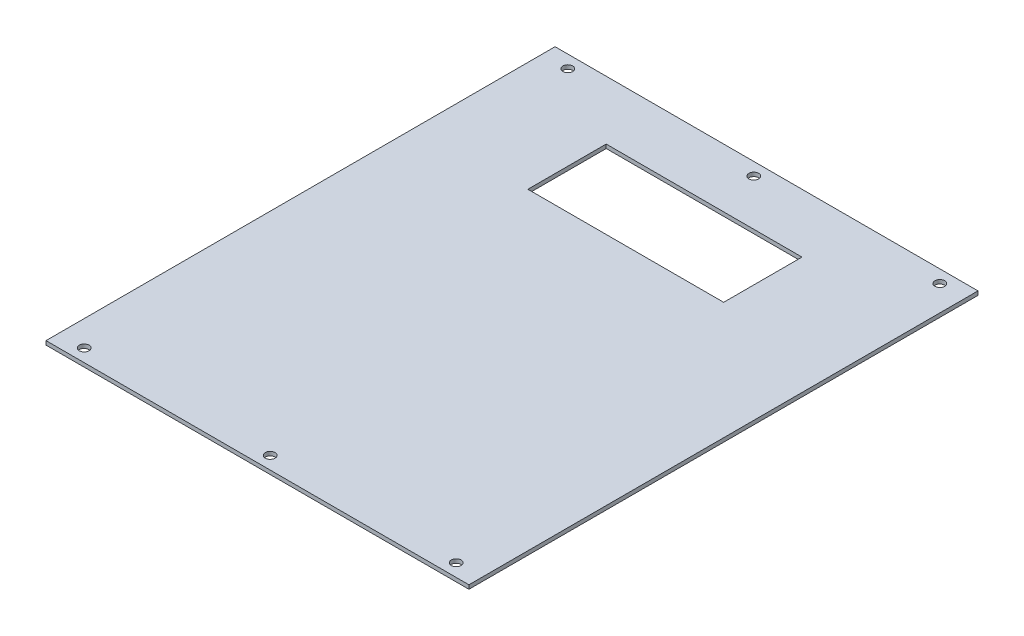
ISO-10303-21;
HEADER;
FILE_DESCRIPTION(('STEP AP214'),'2;1');
FILE_NAME('part.step','',(''),(''),'','','');
FILE_SCHEMA(('AUTOMOTIVE_DESIGN { 1 0 10303 214 1 1 1 1 }'));
ENDSEC;
DATA;
#1=APPLICATION_CONTEXT('core data for automotive mechanical design processes');
#2=APPLICATION_PROTOCOL_DEFINITION('international standard','automotive_design',2000,#1);
#3=PRODUCT_CONTEXT('',#1,'mechanical');
#4=PRODUCT('Part','Part','',(#3));
#5=PRODUCT_RELATED_PRODUCT_CATEGORY('part','',(#4));
#6=PRODUCT_DEFINITION_FORMATION('','',#4);
#7=PRODUCT_DEFINITION_CONTEXT('part definition',#1,'design');
#8=PRODUCT_DEFINITION('design','',#6,#7);
#9=PRODUCT_DEFINITION_SHAPE('','',#8);
#10=(LENGTH_UNIT() NAMED_UNIT(*) SI_UNIT(.MILLI.,.METRE.));
#11=(NAMED_UNIT(*) PLANE_ANGLE_UNIT() SI_UNIT($,.RADIAN.));
#12=(NAMED_UNIT(*) SI_UNIT($,.STERADIAN.) SOLID_ANGLE_UNIT());
#13=UNCERTAINTY_MEASURE_WITH_UNIT(LENGTH_MEASURE(1.E-05),#10,'distance_accuracy_value','');
#14=(GEOMETRIC_REPRESENTATION_CONTEXT(3) GLOBAL_UNCERTAINTY_ASSIGNED_CONTEXT((#13)) GLOBAL_UNIT_ASSIGNED_CONTEXT((#10,
#11,#12)) REPRESENTATION_CONTEXT('',''));
#15=CARTESIAN_POINT('',(0.,0.,0.));
#16=DIRECTION('',(0.,0.,1.));
#17=DIRECTION('',(1.,0.,0.));
#18=AXIS2_PLACEMENT_3D('',#15,#16,#17);
#19=CARTESIAN_POINT('',(-108.,2.,130.));
#20=DIRECTION('',(1.,0.,0.));
#21=DIRECTION('',(0.,0.,-1.));
#22=AXIS2_PLACEMENT_3D('',#19,#20,#21);
#23=PLANE('',#22);
#24=DIRECTION('',(0.,0.,1.));
#25=VECTOR('',#24,1.);
#26=CARTESIAN_POINT('',(-108.,0.,130.));
#27=LINE('',#26,#25);
#28=CARTESIAN_POINT('',(-108.,0.,-130.));
#29=VERTEX_POINT('',#28);
#30=CARTESIAN_POINT('',(-108.,0.,130.));
#31=VERTEX_POINT('',#30);
#32=EDGE_CURVE('E134',#29,#31,#27,.T.);
#33=ORIENTED_EDGE('',*,*,#32,.T.);
#34=DIRECTION('',(0.,-1.,0.));
#35=VECTOR('',#34,1.);
#36=CARTESIAN_POINT('',(-108.,2.,130.));
#37=LINE('',#36,#35);
#38=CARTESIAN_POINT('',(-108.,2.,130.));
#39=VERTEX_POINT('',#38);
#40=EDGE_CURVE('E11',#39,#31,#37,.T.);
#41=ORIENTED_EDGE('',*,*,#40,.F.);
#42=DIRECTION('',(0.,0.,1.));
#43=VECTOR('',#42,1.);
#44=CARTESIAN_POINT('',(-108.,2.,130.));
#45=LINE('',#44,#43);
#46=CARTESIAN_POINT('',(-108.,2.,-130.));
#47=VERTEX_POINT('',#46);
#48=EDGE_CURVE('E138',#47,#39,#45,.T.);
#49=ORIENTED_EDGE('',*,*,#48,.F.);
#50=DIRECTION('',(0.,-1.,0.));
#51=VECTOR('',#50,1.);
#52=CARTESIAN_POINT('',(-108.,2.,-130.));
#53=LINE('',#52,#51);
#54=EDGE_CURVE('E148',#47,#29,#53,.T.);
#55=ORIENTED_EDGE('',*,*,#54,.T.);
#56=EDGE_LOOP('',(#33,#41,#49,#55));
#57=FACE_BOUND('',#56,.T.);
#58=ADVANCED_FACE('F34',(#57),#23,.F.);
#59=CARTESIAN_POINT('',(108.,2.,130.));
#60=DIRECTION('',(0.,0.,-1.));
#61=DIRECTION('',(-1.,0.,0.));
#62=AXIS2_PLACEMENT_3D('',#59,#60,#61);
#63=PLANE('',#62);
#64=DIRECTION('',(1.,0.,0.));
#65=VECTOR('',#64,1.);
#66=CARTESIAN_POINT('',(108.,0.,130.));
#67=LINE('',#66,#65);
#68=CARTESIAN_POINT('',(108.,0.,130.));
#69=VERTEX_POINT('',#68);
#70=EDGE_CURVE('E151',#31,#69,#67,.T.);
#71=ORIENTED_EDGE('',*,*,#70,.T.);
#72=DIRECTION('',(0.,-1.,0.));
#73=VECTOR('',#72,1.);
#74=CARTESIAN_POINT('',(108.,2.,130.));
#75=LINE('',#74,#73);
#76=CARTESIAN_POINT('',(108.,2.,130.));
#77=VERTEX_POINT('',#76);
#78=EDGE_CURVE('E41',#77,#69,#75,.T.);
#79=ORIENTED_EDGE('',*,*,#78,.F.);
#80=DIRECTION('',(1.,0.,0.));
#81=VECTOR('',#80,1.);
#82=CARTESIAN_POINT('',(108.,2.,130.));
#83=LINE('',#82,#81);
#84=EDGE_CURVE('E141',#39,#77,#83,.T.);
#85=ORIENTED_EDGE('',*,*,#84,.F.);
#86=ORIENTED_EDGE('',*,*,#40,.T.);
#87=EDGE_LOOP('',(#71,#79,#85,#86));
#88=FACE_BOUND('',#87,.T.);
#89=ADVANCED_FACE('F179',(#88),#63,.F.);
#90=CARTESIAN_POINT('',(108.,2.,130.));
#91=DIRECTION('',(-1.,0.,0.));
#92=DIRECTION('',(0.,0.,1.));
#93=AXIS2_PLACEMENT_3D('',#90,#91,#92);
#94=PLANE('',#93);
#95=DIRECTION('',(0.,0.,-1.));
#96=VECTOR('',#95,1.);
#97=CARTESIAN_POINT('',(108.,0.,130.));
#98=LINE('',#97,#96);
#99=CARTESIAN_POINT('',(108.,0.,-130.));
#100=VERTEX_POINT('',#99);
#101=EDGE_CURVE('E153',#69,#100,#98,.T.);
#102=ORIENTED_EDGE('',*,*,#101,.T.);
#103=DIRECTION('',(0.,-1.,0.));
#104=VECTOR('',#103,1.);
#105=CARTESIAN_POINT('',(108.,2.,-130.));
#106=LINE('',#105,#104);
#107=CARTESIAN_POINT('',(108.,2.,-130.));
#108=VERTEX_POINT('',#107);
#109=EDGE_CURVE('E158',#108,#100,#106,.T.);
#110=ORIENTED_EDGE('',*,*,#109,.F.);
#111=DIRECTION('',(0.,0.,-1.));
#112=VECTOR('',#111,1.);
#113=CARTESIAN_POINT('',(108.,2.,130.));
#114=LINE('',#113,#112);
#115=EDGE_CURVE('E144',#77,#108,#114,.T.);
#116=ORIENTED_EDGE('',*,*,#115,.F.);
#117=ORIENTED_EDGE('',*,*,#78,.T.);
#118=EDGE_LOOP('',(#102,#110,#116,#117));
#119=FACE_BOUND('',#118,.T.);
#120=ADVANCED_FACE('F165',(#119),#94,.F.);
#121=CARTESIAN_POINT('',(108.,2.,-130.));
#122=DIRECTION('',(0.,0.,1.));
#123=DIRECTION('',(1.,0.,0.));
#124=AXIS2_PLACEMENT_3D('',#121,#122,#123);
#125=PLANE('',#124);
#126=DIRECTION('',(-1.,0.,0.));
#127=VECTOR('',#126,1.);
#128=CARTESIAN_POINT('',(108.,0.,-130.));
#129=LINE('',#128,#127);
#130=EDGE_CURVE('E142',#100,#29,#129,.T.);
#131=ORIENTED_EDGE('',*,*,#130,.T.);
#132=ORIENTED_EDGE('',*,*,#54,.F.);
#133=DIRECTION('',(-1.,0.,0.));
#134=VECTOR('',#133,1.);
#135=CARTESIAN_POINT('',(108.,2.,-130.));
#136=LINE('',#135,#134);
#137=EDGE_CURVE('E146',#108,#47,#136,.T.);
#138=ORIENTED_EDGE('',*,*,#137,.F.);
#139=ORIENTED_EDGE('',*,*,#109,.T.);
#140=EDGE_LOOP('',(#131,#132,#138,#139));
#141=FACE_BOUND('',#140,.T.);
#142=ADVANCED_FACE('F174',(#141),#125,.F.);
#143=CARTESIAN_POINT('',(0.,2.,0.));
#144=DIRECTION('',(0.,1.,0.));
#145=DIRECTION('',(0.,0.,1.));
#146=AXIS2_PLACEMENT_3D('',#143,#144,#145);
#147=PLANE('',#146);
#148=CARTESIAN_POINT('',(94.9999999999998,1.99999999999997,-123.5));
#149=DIRECTION('',(0.,-1.,0.));
#150=DIRECTION('',(0.,0.,-1.));
#151=AXIS2_PLACEMENT_3D('',#148,#149,#150);
#152=CIRCLE('',#151,2.49999999999995);
#153=CARTESIAN_POINT('',(94.9999999999998,1.99999999999997,-126.));
#154=VERTEX_POINT('',#153);
#155=EDGE_CURVE('E234',#154,#154,#152,.T.);
#156=ORIENTED_EDGE('',*,*,#155,.T.);
#157=EDGE_LOOP('',(#156));
#158=FACE_BOUND('',#157,.T.);
#159=CARTESIAN_POINT('',(-2.08166817117217E-13,1.99999999999997,-123.5));
#160=DIRECTION('',(0.,-1.,0.));
#161=DIRECTION('',(0.,0.,-1.));
#162=AXIS2_PLACEMENT_3D('',#159,#160,#161);
#163=CIRCLE('',#162,2.49999999999994);
#164=CARTESIAN_POINT('',(-2.08166817117217E-13,1.99999999999997,-126.));
#165=VERTEX_POINT('',#164);
#166=EDGE_CURVE('E244',#165,#165,#163,.T.);
#167=ORIENTED_EDGE('',*,*,#166,.T.);
#168=EDGE_LOOP('',(#167));
#169=FACE_BOUND('',#168,.T.);
#170=CARTESIAN_POINT('',(-95.0000000000002,1.99999999999997,-123.5));
#171=DIRECTION('',(0.,-1.,0.));
#172=DIRECTION('',(0.,0.,-1.));
#173=AXIS2_PLACEMENT_3D('',#170,#171,#172);
#174=CIRCLE('',#173,2.49999999999995);
#175=CARTESIAN_POINT('',(-95.0000000000002,1.99999999999997,-126.));
#176=VERTEX_POINT('',#175);
#177=EDGE_CURVE('E250',#176,#176,#174,.T.);
#178=ORIENTED_EDGE('',*,*,#177,.T.);
#179=EDGE_LOOP('',(#178));
#180=FACE_BOUND('',#179,.T.);
#181=CARTESIAN_POINT('',(95.0000000000001,1.99999999999997,123.5));
#182=DIRECTION('',(0.,-1.,0.));
#183=DIRECTION('',(0.,0.,-1.));
#184=AXIS2_PLACEMENT_3D('',#181,#182,#183);
#185=CIRCLE('',#184,2.49999999999995);
#186=CARTESIAN_POINT('',(95.0000000000001,1.99999999999997,121.));
#187=VERTEX_POINT('',#186);
#188=EDGE_CURVE('E256',#187,#187,#185,.T.);
#189=ORIENTED_EDGE('',*,*,#188,.T.);
#190=EDGE_LOOP('',(#189));
#191=FACE_BOUND('',#190,.T.);
#192=CARTESIAN_POINT('',(0.,1.99999999999997,123.5));
#193=DIRECTION('',(0.,-1.,0.));
#194=DIRECTION('',(0.,0.,-1.));
#195=AXIS2_PLACEMENT_3D('',#192,#193,#194);
#196=CIRCLE('',#195,2.49999999999994);
#197=CARTESIAN_POINT('',(0.,1.99999999999997,121.));
#198=VERTEX_POINT('',#197);
#199=EDGE_CURVE('E262',#198,#198,#196,.T.);
#200=ORIENTED_EDGE('',*,*,#199,.T.);
#201=EDGE_LOOP('',(#200));
#202=FACE_BOUND('',#201,.T.);
#203=CARTESIAN_POINT('',(-94.9999999999999,1.99999999999997,123.5));
#204=DIRECTION('',(0.,-1.,0.));
#205=DIRECTION('',(0.,0.,-1.));
#206=AXIS2_PLACEMENT_3D('',#203,#204,#205);
#207=CIRCLE('',#206,2.49999999999995);
#208=CARTESIAN_POINT('',(-94.9999999999999,1.99999999999997,121.));
#209=VERTEX_POINT('',#208);
#210=EDGE_CURVE('E122',#209,#209,#207,.T.);
#211=ORIENTED_EDGE('',*,*,#210,.T.);
#212=EDGE_LOOP('',(#211));
#213=FACE_BOUND('',#212,.T.);
#214=DIRECTION('',(0.,0.,1.));
#215=VECTOR('',#214,1.);
#216=CARTESIAN_POINT('',(48.1109945030005,2.,-60.));
#217=LINE('',#216,#215);
#218=CARTESIAN_POINT('',(48.1109945030005,2.,-100.));
#219=VERTEX_POINT('',#218);
#220=CARTESIAN_POINT('',(48.1109945030005,2.,-60.));
#221=VERTEX_POINT('',#220);
#222=EDGE_CURVE('E100',#219,#221,#217,.T.);
#223=ORIENTED_EDGE('',*,*,#222,.T.);
#224=DIRECTION('',(-1.,0.,0.));
#225=VECTOR('',#224,1.);
#226=CARTESIAN_POINT('',(-51.8890054969995,2.,-60.));
#227=LINE('',#226,#225);
#228=CARTESIAN_POINT('',(-51.8890054969995,2.,-60.));
#229=VERTEX_POINT('',#228);
#230=EDGE_CURVE('E109',#221,#229,#227,.T.);
#231=ORIENTED_EDGE('',*,*,#230,.T.);
#232=DIRECTION('',(0.,0.,-1.));
#233=VECTOR('',#232,1.);
#234=CARTESIAN_POINT('',(-51.8890054969995,2.,-60.));
#235=LINE('',#234,#233);
#236=CARTESIAN_POINT('',(-51.8890054969995,2.,-100.));
#237=VERTEX_POINT('',#236);
#238=EDGE_CURVE('E48',#229,#237,#235,.T.);
#239=ORIENTED_EDGE('',*,*,#238,.T.);
#240=DIRECTION('',(1.,0.,0.));
#241=VECTOR('',#240,1.);
#242=CARTESIAN_POINT('',(-51.8890054969995,2.,-100.));
#243=LINE('',#242,#241);
#244=EDGE_CURVE('E106',#237,#219,#243,.T.);
#245=ORIENTED_EDGE('',*,*,#244,.T.);
#246=EDGE_LOOP('',(#223,#231,#239,#245));
#247=FACE_BOUND('',#246,.T.);
#248=ORIENTED_EDGE('',*,*,#48,.T.);
#249=ORIENTED_EDGE('',*,*,#84,.T.);
#250=ORIENTED_EDGE('',*,*,#115,.T.);
#251=ORIENTED_EDGE('',*,*,#137,.T.);
#252=EDGE_LOOP('',(#248,#249,#250,#251));
#253=FACE_BOUND('',#252,.T.);
#254=ADVANCED_FACE('F113',(#158,#169,#180,#191,#202,#213,#247,#253),#147,.T.);
#255=CARTESIAN_POINT('',(0.,0.,0.));
#256=DIRECTION('',(0.,1.,0.));
#257=DIRECTION('',(0.,0.,1.));
#258=AXIS2_PLACEMENT_3D('',#255,#256,#257);
#259=PLANE('',#258);
#260=CARTESIAN_POINT('',(94.9999999999998,0.,-123.5));
#261=DIRECTION('',(0.,-1.,0.));
#262=DIRECTION('',(0.,0.,-1.));
#263=AXIS2_PLACEMENT_3D('',#260,#261,#262);
#264=CIRCLE('',#263,2.49999999999995);
#265=CARTESIAN_POINT('',(94.9999999999998,0.,-126.));
#266=VERTEX_POINT('',#265);
#267=EDGE_CURVE('E237',#266,#266,#264,.T.);
#268=ORIENTED_EDGE('',*,*,#267,.F.);
#269=EDGE_LOOP('',(#268));
#270=FACE_BOUND('',#269,.T.);
#271=CARTESIAN_POINT('',(-2.08166817117217E-13,0.,-123.5));
#272=DIRECTION('',(0.,-1.,0.));
#273=DIRECTION('',(0.,0.,-1.));
#274=AXIS2_PLACEMENT_3D('',#271,#272,#273);
#275=CIRCLE('',#274,2.49999999999994);
#276=CARTESIAN_POINT('',(-2.08166817117217E-13,0.,-126.));
#277=VERTEX_POINT('',#276);
#278=EDGE_CURVE('E239',#277,#277,#275,.T.);
#279=ORIENTED_EDGE('',*,*,#278,.F.);
#280=EDGE_LOOP('',(#279));
#281=FACE_BOUND('',#280,.T.);
#282=CARTESIAN_POINT('',(-95.0000000000002,0.,-123.5));
#283=DIRECTION('',(0.,-1.,0.));
#284=DIRECTION('',(0.,0.,-1.));
#285=AXIS2_PLACEMENT_3D('',#282,#283,#284);
#286=CIRCLE('',#285,2.49999999999995);
#287=CARTESIAN_POINT('',(-95.0000000000002,0.,-126.));
#288=VERTEX_POINT('',#287);
#289=EDGE_CURVE('E247',#288,#288,#286,.T.);
#290=ORIENTED_EDGE('',*,*,#289,.F.);
#291=EDGE_LOOP('',(#290));
#292=FACE_BOUND('',#291,.T.);
#293=CARTESIAN_POINT('',(95.0000000000001,0.,123.5));
#294=DIRECTION('',(0.,-1.,0.));
#295=DIRECTION('',(0.,0.,-1.));
#296=AXIS2_PLACEMENT_3D('',#293,#294,#295);
#297=CIRCLE('',#296,2.49999999999995);
#298=CARTESIAN_POINT('',(95.0000000000001,0.,121.));
#299=VERTEX_POINT('',#298);
#300=EDGE_CURVE('E253',#299,#299,#297,.T.);
#301=ORIENTED_EDGE('',*,*,#300,.F.);
#302=EDGE_LOOP('',(#301));
#303=FACE_BOUND('',#302,.T.);
#304=CARTESIAN_POINT('',(0.,0.,123.5));
#305=DIRECTION('',(0.,-1.,0.));
#306=DIRECTION('',(0.,0.,-1.));
#307=AXIS2_PLACEMENT_3D('',#304,#305,#306);
#308=CIRCLE('',#307,2.49999999999994);
#309=CARTESIAN_POINT('',(0.,0.,121.));
#310=VERTEX_POINT('',#309);
#311=EDGE_CURVE('E259',#310,#310,#308,.T.);
#312=ORIENTED_EDGE('',*,*,#311,.F.);
#313=EDGE_LOOP('',(#312));
#314=FACE_BOUND('',#313,.T.);
#315=CARTESIAN_POINT('',(-94.9999999999999,0.,123.5));
#316=DIRECTION('',(0.,-1.,0.));
#317=DIRECTION('',(0.,0.,-1.));
#318=AXIS2_PLACEMENT_3D('',#315,#316,#317);
#319=CIRCLE('',#318,2.49999999999995);
#320=CARTESIAN_POINT('',(-94.9999999999999,0.,121.));
#321=VERTEX_POINT('',#320);
#322=EDGE_CURVE('E264',#321,#321,#319,.T.);
#323=ORIENTED_EDGE('',*,*,#322,.F.);
#324=EDGE_LOOP('',(#323));
#325=FACE_BOUND('',#324,.T.);
#326=DIRECTION('',(-1.,0.,0.));
#327=VECTOR('',#326,1.);
#328=CARTESIAN_POINT('',(-51.8890054969995,0.,-60.));
#329=LINE('',#328,#327);
#330=CARTESIAN_POINT('',(48.1109945030005,0.,-60.));
#331=VERTEX_POINT('',#330);
#332=CARTESIAN_POINT('',(-51.8890054969995,0.,-60.));
#333=VERTEX_POINT('',#332);
#334=EDGE_CURVE('E128',#331,#333,#329,.T.);
#335=ORIENTED_EDGE('',*,*,#334,.F.);
#336=DIRECTION('',(0.,0.,1.));
#337=VECTOR('',#336,1.);
#338=CARTESIAN_POINT('',(48.1109945030005,0.,-60.));
#339=LINE('',#338,#337);
#340=CARTESIAN_POINT('',(48.1109945030005,0.,-100.));
#341=VERTEX_POINT('',#340);
#342=EDGE_CURVE('E56',#341,#331,#339,.T.);
#343=ORIENTED_EDGE('',*,*,#342,.F.);
#344=DIRECTION('',(1.,0.,0.));
#345=VECTOR('',#344,1.);
#346=CARTESIAN_POINT('',(-51.8890054969995,0.,-100.));
#347=LINE('',#346,#345);
#348=CARTESIAN_POINT('',(-51.8890054969995,0.,-100.));
#349=VERTEX_POINT('',#348);
#350=EDGE_CURVE('E116',#349,#341,#347,.T.);
#351=ORIENTED_EDGE('',*,*,#350,.F.);
#352=DIRECTION('',(0.,0.,-1.));
#353=VECTOR('',#352,1.);
#354=CARTESIAN_POINT('',(-51.8890054969995,0.,-60.));
#355=LINE('',#354,#353);
#356=EDGE_CURVE('E119',#333,#349,#355,.T.);
#357=ORIENTED_EDGE('',*,*,#356,.F.);
#358=EDGE_LOOP('',(#335,#343,#351,#357));
#359=FACE_BOUND('',#358,.T.);
#360=ORIENTED_EDGE('',*,*,#32,.F.);
#361=ORIENTED_EDGE('',*,*,#130,.F.);
#362=ORIENTED_EDGE('',*,*,#101,.F.);
#363=ORIENTED_EDGE('',*,*,#70,.F.);
#364=EDGE_LOOP('',(#360,#361,#362,#363));
#365=FACE_BOUND('',#364,.T.);
#366=ADVANCED_FACE('F171',(#270,#281,#292,#303,#314,#325,#359,#365),#259,.F.);
#367=CARTESIAN_POINT('',(48.1109945030005,2.,-60.));
#368=DIRECTION('',(1.,0.,0.));
#369=DIRECTION('',(0.,0.,-1.));
#370=AXIS2_PLACEMENT_3D('',#367,#368,#369);
#371=PLANE('',#370);
#372=ORIENTED_EDGE('',*,*,#342,.T.);
#373=DIRECTION('',(0.,-1.,0.));
#374=VECTOR('',#373,1.);
#375=CARTESIAN_POINT('',(48.1109945030005,2.,-60.));
#376=LINE('',#375,#374);
#377=EDGE_CURVE('E96',#221,#331,#376,.T.);
#378=ORIENTED_EDGE('',*,*,#377,.F.);
#379=ORIENTED_EDGE('',*,*,#222,.F.);
#380=DIRECTION('',(0.,-1.,0.));
#381=VECTOR('',#380,1.);
#382=CARTESIAN_POINT('',(48.1109945030005,2.,-100.));
#383=LINE('',#382,#381);
#384=EDGE_CURVE('E132',#219,#341,#383,.T.);
#385=ORIENTED_EDGE('',*,*,#384,.T.);
#386=EDGE_LOOP('',(#372,#378,#379,#385));
#387=FACE_BOUND('',#386,.T.);
#388=ADVANCED_FACE('F98',(#387),#371,.F.);
#389=CARTESIAN_POINT('',(-51.8890054969995,2.,-100.));
#390=DIRECTION('',(0.,0.,-1.));
#391=DIRECTION('',(-1.,0.,0.));
#392=AXIS2_PLACEMENT_3D('',#389,#390,#391);
#393=PLANE('',#392);
#394=ORIENTED_EDGE('',*,*,#350,.T.);
#395=ORIENTED_EDGE('',*,*,#384,.F.);
#396=ORIENTED_EDGE('',*,*,#244,.F.);
#397=DIRECTION('',(0.,-1.,0.));
#398=VECTOR('',#397,1.);
#399=CARTESIAN_POINT('',(-51.8890054969995,2.,-100.));
#400=LINE('',#399,#398);
#401=EDGE_CURVE('E135',#237,#349,#400,.T.);
#402=ORIENTED_EDGE('',*,*,#401,.T.);
#403=EDGE_LOOP('',(#394,#395,#396,#402));
#404=FACE_BOUND('',#403,.T.);
#405=ADVANCED_FACE('F197',(#404),#393,.F.);
#406=CARTESIAN_POINT('',(-51.8890054969995,2.,-60.));
#407=DIRECTION('',(-1.,0.,0.));
#408=DIRECTION('',(0.,0.,1.));
#409=AXIS2_PLACEMENT_3D('',#406,#407,#408);
#410=PLANE('',#409);
#411=ORIENTED_EDGE('',*,*,#356,.T.);
#412=ORIENTED_EDGE('',*,*,#401,.F.);
#413=ORIENTED_EDGE('',*,*,#238,.F.);
#414=DIRECTION('',(0.,-1.,0.));
#415=VECTOR('',#414,1.);
#416=CARTESIAN_POINT('',(-51.8890054969995,2.,-60.));
#417=LINE('',#416,#415);
#418=EDGE_CURVE('E105',#229,#333,#417,.T.);
#419=ORIENTED_EDGE('',*,*,#418,.T.);
#420=EDGE_LOOP('',(#411,#412,#413,#419));
#421=FACE_BOUND('',#420,.T.);
#422=ADVANCED_FACE('F201',(#421),#410,.F.);
#423=CARTESIAN_POINT('',(-51.8890054969995,2.,-60.));
#424=DIRECTION('',(0.,0.,1.));
#425=DIRECTION('',(1.,0.,0.));
#426=AXIS2_PLACEMENT_3D('',#423,#424,#425);
#427=PLANE('',#426);
#428=ORIENTED_EDGE('',*,*,#334,.T.);
#429=ORIENTED_EDGE('',*,*,#418,.F.);
#430=ORIENTED_EDGE('',*,*,#230,.F.);
#431=ORIENTED_EDGE('',*,*,#377,.T.);
#432=EDGE_LOOP('',(#428,#429,#430,#431));
#433=FACE_BOUND('',#432,.T.);
#434=ADVANCED_FACE('F110',(#433),#427,.F.);
#435=CARTESIAN_POINT('',(-94.9999999999999,0.,123.5));
#436=DIRECTION('',(0.,-1.,0.));
#437=DIRECTION('',(0.,0.,-1.));
#438=AXIS2_PLACEMENT_3D('',#435,#436,#437);
#439=CYLINDRICAL_SURFACE('',#438,2.49999999999995);
#440=ORIENTED_EDGE('',*,*,#210,.F.);
#441=EDGE_LOOP('',(#440));
#442=FACE_BOUND('',#441,.T.);
#443=ORIENTED_EDGE('',*,*,#322,.T.);
#444=EDGE_LOOP('',(#443));
#445=FACE_BOUND('',#444,.T.);
#446=ADVANCED_FACE('F200',(#442,#445),#439,.F.);
#447=CARTESIAN_POINT('',(0.,0.,123.5));
#448=DIRECTION('',(0.,-1.,0.));
#449=DIRECTION('',(0.,0.,-1.));
#450=AXIS2_PLACEMENT_3D('',#447,#448,#449);
#451=CYLINDRICAL_SURFACE('',#450,2.49999999999994);
#452=ORIENTED_EDGE('',*,*,#199,.F.);
#453=EDGE_LOOP('',(#452));
#454=FACE_BOUND('',#453,.T.);
#455=ORIENTED_EDGE('',*,*,#311,.T.);
#456=EDGE_LOOP('',(#455));
#457=FACE_BOUND('',#456,.T.);
#458=ADVANCED_FACE('F209',(#454,#457),#451,.F.);
#459=CARTESIAN_POINT('',(95.0000000000001,0.,123.5));
#460=DIRECTION('',(0.,-1.,0.));
#461=DIRECTION('',(0.,0.,-1.));
#462=AXIS2_PLACEMENT_3D('',#459,#460,#461);
#463=CYLINDRICAL_SURFACE('',#462,2.49999999999995);
#464=ORIENTED_EDGE('',*,*,#188,.F.);
#465=EDGE_LOOP('',(#464));
#466=FACE_BOUND('',#465,.T.);
#467=ORIENTED_EDGE('',*,*,#300,.T.);
#468=EDGE_LOOP('',(#467));
#469=FACE_BOUND('',#468,.T.);
#470=ADVANCED_FACE('F213',(#466,#469),#463,.F.);
#471=CARTESIAN_POINT('',(-95.0000000000002,0.,-123.5));
#472=DIRECTION('',(0.,-1.,0.));
#473=DIRECTION('',(0.,0.,-1.));
#474=AXIS2_PLACEMENT_3D('',#471,#472,#473);
#475=CYLINDRICAL_SURFACE('',#474,2.49999999999995);
#476=ORIENTED_EDGE('',*,*,#177,.F.);
#477=EDGE_LOOP('',(#476));
#478=FACE_BOUND('',#477,.T.);
#479=ORIENTED_EDGE('',*,*,#289,.T.);
#480=EDGE_LOOP('',(#479));
#481=FACE_BOUND('',#480,.T.);
#482=ADVANCED_FACE('F217',(#478,#481),#475,.F.);
#483=CARTESIAN_POINT('',(-2.08166817117217E-13,0.,-123.5));
#484=DIRECTION('',(0.,-1.,0.));
#485=DIRECTION('',(0.,0.,-1.));
#486=AXIS2_PLACEMENT_3D('',#483,#484,#485);
#487=CYLINDRICAL_SURFACE('',#486,2.49999999999994);
#488=ORIENTED_EDGE('',*,*,#166,.F.);
#489=EDGE_LOOP('',(#488));
#490=FACE_BOUND('',#489,.T.);
#491=ORIENTED_EDGE('',*,*,#278,.T.);
#492=EDGE_LOOP('',(#491));
#493=FACE_BOUND('',#492,.T.);
#494=ADVANCED_FACE('F221',(#490,#493),#487,.F.);
#495=CARTESIAN_POINT('',(94.9999999999998,0.,-123.5));
#496=DIRECTION('',(0.,-1.,0.));
#497=DIRECTION('',(0.,0.,-1.));
#498=AXIS2_PLACEMENT_3D('',#495,#496,#497);
#499=CYLINDRICAL_SURFACE('',#498,2.49999999999995);
#500=ORIENTED_EDGE('',*,*,#155,.F.);
#501=EDGE_LOOP('',(#500));
#502=FACE_BOUND('',#501,.T.);
#503=ORIENTED_EDGE('',*,*,#267,.T.);
#504=EDGE_LOOP('',(#503));
#505=FACE_BOUND('',#504,.T.);
#506=ADVANCED_FACE('F225',(#502,#505),#499,.F.);
#507=CLOSED_SHELL('',(#58,#89,#120,#142,#254,#366,#388,#405,#422,#434,#446,#458,#470,#482,#494,#506));
#508=MANIFOLD_SOLID_BREP('B2',#507);
#509=ADVANCED_BREP_SHAPE_REPRESENTATION('',(#18,#508),#14);
#510=SHAPE_DEFINITION_REPRESENTATION(#9,#509);
ENDSEC;
END-ISO-10303-21;
